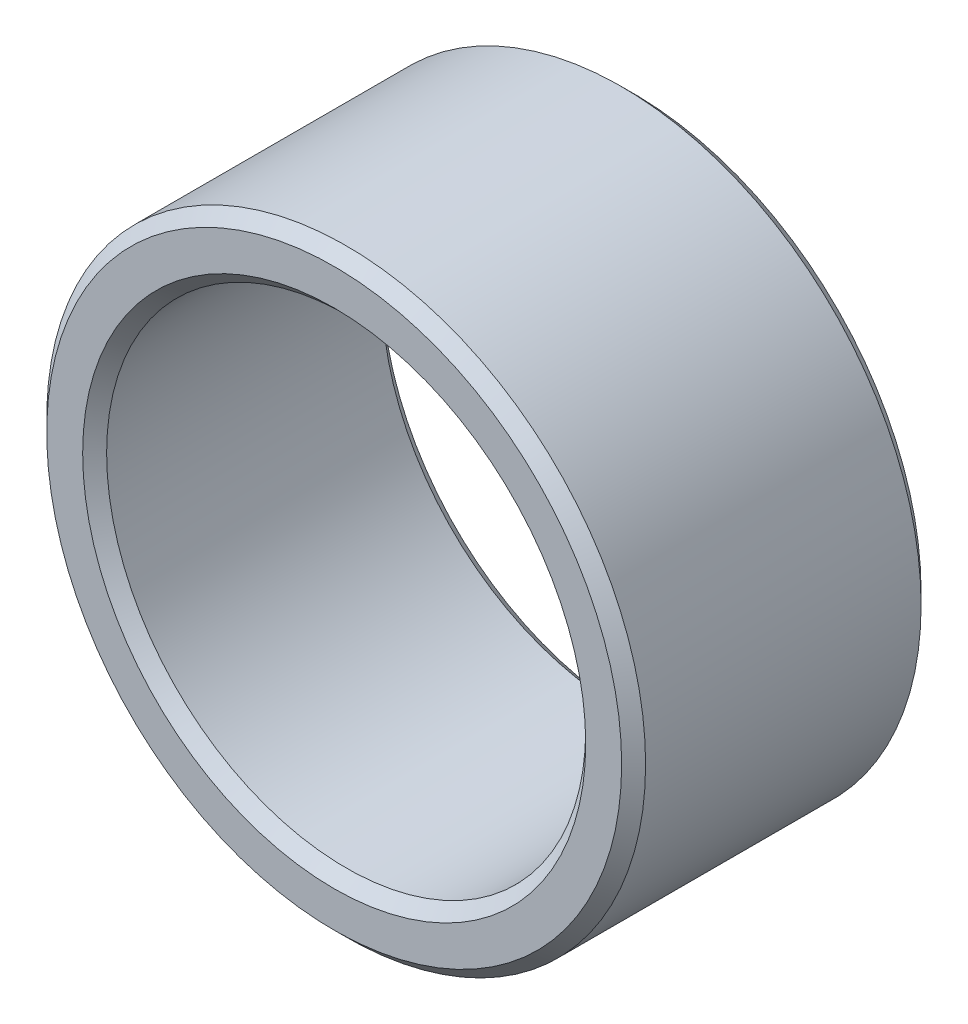
ISO-10303-21;
HEADER;
FILE_DESCRIPTION(('STEP AP214'),'2;1');
FILE_NAME('part.step','',(''),(''),'','','');
FILE_SCHEMA(('AUTOMOTIVE_DESIGN { 1 0 10303 214 1 1 1 1 }'));
ENDSEC;
DATA;
#1=APPLICATION_CONTEXT('core data for automotive mechanical design processes');
#2=APPLICATION_PROTOCOL_DEFINITION('international standard','automotive_design',2000,#1);
#3=PRODUCT_CONTEXT('',#1,'mechanical');
#4=PRODUCT('Part','Part','',(#3));
#5=PRODUCT_RELATED_PRODUCT_CATEGORY('part','',(#4));
#6=PRODUCT_DEFINITION_FORMATION('','',#4);
#7=PRODUCT_DEFINITION_CONTEXT('part definition',#1,'design');
#8=PRODUCT_DEFINITION('design','',#6,#7);
#9=PRODUCT_DEFINITION_SHAPE('','',#8);
#10=(LENGTH_UNIT() NAMED_UNIT(*) SI_UNIT(.MILLI.,.METRE.));
#11=(NAMED_UNIT(*) PLANE_ANGLE_UNIT() SI_UNIT($,.RADIAN.));
#12=(NAMED_UNIT(*) SI_UNIT($,.STERADIAN.) SOLID_ANGLE_UNIT());
#13=UNCERTAINTY_MEASURE_WITH_UNIT(LENGTH_MEASURE(1.E-05),#10,'distance_accuracy_value','');
#14=(GEOMETRIC_REPRESENTATION_CONTEXT(3) GLOBAL_UNCERTAINTY_ASSIGNED_CONTEXT((#13)) GLOBAL_UNIT_ASSIGNED_CONTEXT((#10,
#11,#12)) REPRESENTATION_CONTEXT('',''));
#15=CARTESIAN_POINT('',(0.,0.,0.));
#16=DIRECTION('',(0.,0.,1.));
#17=DIRECTION('',(1.,0.,0.));
#18=AXIS2_PLACEMENT_3D('',#15,#16,#17);
#19=CARTESIAN_POINT('',(0.,0.,5.));
#20=DIRECTION('',(0.,0.,1.));
#21=DIRECTION('',(1.,0.,0.));
#22=AXIS2_PLACEMENT_3D('',#19,#20,#21);
#23=PLANE('',#22);
#24=CARTESIAN_POINT('',(0.,0.,5.));
#25=DIRECTION('',(0.,0.,1.));
#26=DIRECTION('',(1.,0.,0.));
#27=AXIS2_PLACEMENT_3D('',#24,#25,#26);
#28=CIRCLE('',#27,4.2);
#29=CARTESIAN_POINT('',(4.2,0.,5.));
#30=VERTEX_POINT('',#29);
#31=EDGE_CURVE('E10',#30,#30,#28,.F.);
#32=ORIENTED_EDGE('',*,*,#31,.T.);
#33=EDGE_LOOP('',(#32));
#34=FACE_BOUND('',#33,.T.);
#35=CARTESIAN_POINT('',(0.,0.,5.));
#36=DIRECTION('',(0.,0.,1.));
#37=DIRECTION('',(1.,0.,0.));
#38=AXIS2_PLACEMENT_3D('',#35,#36,#37);
#39=CIRCLE('',#38,4.8);
#40=CARTESIAN_POINT('',(4.8,0.,5.));
#41=VERTEX_POINT('',#40);
#42=EDGE_CURVE('E21',#41,#41,#39,.T.);
#43=ORIENTED_EDGE('',*,*,#42,.T.);
#44=EDGE_LOOP('',(#43));
#45=FACE_BOUND('',#44,.T.);
#46=ADVANCED_FACE('F15',(#34,#45),#23,.T.);
#47=CARTESIAN_POINT('',(0.,0.,0.));
#48=DIRECTION('',(0.,0.,1.));
#49=DIRECTION('',(1.,0.,0.));
#50=AXIS2_PLACEMENT_3D('',#47,#48,#49);
#51=PLANE('',#50);
#52=CARTESIAN_POINT('',(0.,0.,0.));
#53=DIRECTION('',(0.,0.,1.));
#54=DIRECTION('',(1.,0.,0.));
#55=AXIS2_PLACEMENT_3D('',#52,#53,#54);
#56=CIRCLE('',#55,4.2);
#57=CARTESIAN_POINT('',(4.2,0.,0.));
#58=VERTEX_POINT('',#57);
#59=EDGE_CURVE('E25',#58,#58,#56,.T.);
#60=ORIENTED_EDGE('',*,*,#59,.T.);
#61=EDGE_LOOP('',(#60));
#62=FACE_BOUND('',#61,.T.);
#63=CARTESIAN_POINT('',(0.,0.,0.));
#64=DIRECTION('',(0.,0.,1.));
#65=DIRECTION('',(1.,0.,0.));
#66=AXIS2_PLACEMENT_3D('',#63,#64,#65);
#67=CIRCLE('',#66,4.8);
#68=CARTESIAN_POINT('',(4.8,0.,0.));
#69=VERTEX_POINT('',#68);
#70=EDGE_CURVE('E29',#69,#69,#67,.F.);
#71=ORIENTED_EDGE('',*,*,#70,.T.);
#72=EDGE_LOOP('',(#71));
#73=FACE_BOUND('',#72,.T.);
#74=ADVANCED_FACE('F66',(#62,#73),#51,.F.);
#75=CARTESIAN_POINT('',(0.,0.,5.));
#76=DIRECTION('',(0.,0.,-1.));
#77=DIRECTION('',(-1.,0.,0.));
#78=AXIS2_PLACEMENT_3D('',#75,#76,#77);
#79=CYLINDRICAL_SURFACE('',#78,5.);
#80=CARTESIAN_POINT('',(0.,0.,0.199999999999999));
#81=DIRECTION('',(0.,0.,1.));
#82=DIRECTION('',(1.,0.,0.));
#83=AXIS2_PLACEMENT_3D('',#80,#81,#82);
#84=CIRCLE('',#83,5.);
#85=CARTESIAN_POINT('',(5.,0.,0.199999999999999));
#86=VERTEX_POINT('',#85);
#87=EDGE_CURVE('E34',#86,#86,#84,.T.);
#88=ORIENTED_EDGE('',*,*,#87,.T.);
#89=EDGE_LOOP('',(#88));
#90=FACE_BOUND('',#89,.T.);
#91=CARTESIAN_POINT('',(0.,0.,4.8));
#92=DIRECTION('',(0.,0.,1.));
#93=DIRECTION('',(1.,0.,0.));
#94=AXIS2_PLACEMENT_3D('',#91,#92,#93);
#95=CIRCLE('',#94,5.);
#96=CARTESIAN_POINT('',(5.,0.,4.8));
#97=VERTEX_POINT('',#96);
#98=EDGE_CURVE('E37',#97,#97,#95,.F.);
#99=ORIENTED_EDGE('',*,*,#98,.T.);
#100=EDGE_LOOP('',(#99));
#101=FACE_BOUND('',#100,.T.);
#102=ADVANCED_FACE('F70',(#90,#101),#79,.T.);
#103=CARTESIAN_POINT('',(0.,0.,5.));
#104=DIRECTION('',(0.,0.,-1.));
#105=DIRECTION('',(-1.,0.,0.));
#106=AXIS2_PLACEMENT_3D('',#103,#104,#105);
#107=CYLINDRICAL_SURFACE('',#106,4.);
#108=CARTESIAN_POINT('',(0.,0.,0.200000000000001));
#109=DIRECTION('',(0.,0.,1.));
#110=DIRECTION('',(1.,0.,0.));
#111=AXIS2_PLACEMENT_3D('',#108,#109,#110);
#112=CIRCLE('',#111,4.);
#113=CARTESIAN_POINT('',(4.,0.,0.200000000000001));
#114=VERTEX_POINT('',#113);
#115=EDGE_CURVE('E40',#114,#114,#112,.F.);
#116=ORIENTED_EDGE('',*,*,#115,.T.);
#117=EDGE_LOOP('',(#116));
#118=FACE_BOUND('',#117,.T.);
#119=CARTESIAN_POINT('',(0.,0.,4.8));
#120=DIRECTION('',(0.,0.,1.));
#121=DIRECTION('',(1.,0.,0.));
#122=AXIS2_PLACEMENT_3D('',#119,#120,#121);
#123=CIRCLE('',#122,4.);
#124=CARTESIAN_POINT('',(4.,0.,4.8));
#125=VERTEX_POINT('',#124);
#126=EDGE_CURVE('E43',#125,#125,#123,.T.);
#127=ORIENTED_EDGE('',*,*,#126,.T.);
#128=EDGE_LOOP('',(#127));
#129=FACE_BOUND('',#128,.T.);
#130=ADVANCED_FACE('F47',(#118,#129),#107,.F.);
#131=CARTESIAN_POINT('',(0.,0.,0.));
#132=DIRECTION('',(0.,0.,-1.));
#133=DIRECTION('',(-1.,0.,0.));
#134=AXIS2_PLACEMENT_3D('',#131,#132,#133);
#135=CONICAL_SURFACE('',#134,4.2,0.785398163397444);
#136=ORIENTED_EDGE('',*,*,#115,.F.);
#137=EDGE_LOOP('',(#136));
#138=FACE_BOUND('',#137,.T.);
#139=ORIENTED_EDGE('',*,*,#59,.F.);
#140=EDGE_LOOP('',(#139));
#141=FACE_BOUND('',#140,.T.);
#142=ADVANCED_FACE('F62',(#138,#141),#135,.F.);
#143=CARTESIAN_POINT('',(0.,0.,0.199999999999999));
#144=DIRECTION('',(0.,0.,1.));
#145=DIRECTION('',(1.,0.,0.));
#146=AXIS2_PLACEMENT_3D('',#143,#144,#145);
#147=CONICAL_SURFACE('',#146,5.,0.78539816339745);
#148=ORIENTED_EDGE('',*,*,#70,.F.);
#149=EDGE_LOOP('',(#148));
#150=FACE_BOUND('',#149,.T.);
#151=ORIENTED_EDGE('',*,*,#87,.F.);
#152=EDGE_LOOP('',(#151));
#153=FACE_BOUND('',#152,.T.);
#154=ADVANCED_FACE('F52',(#150,#153),#147,.T.);
#155=CARTESIAN_POINT('',(0.,0.,4.8));
#156=DIRECTION('',(0.,0.,1.));
#157=DIRECTION('',(1.,0.,0.));
#158=AXIS2_PLACEMENT_3D('',#155,#156,#157);
#159=CONICAL_SURFACE('',#158,4.,0.785398163397446);
#160=ORIENTED_EDGE('',*,*,#31,.F.);
#161=EDGE_LOOP('',(#160));
#162=FACE_BOUND('',#161,.T.);
#163=ORIENTED_EDGE('',*,*,#126,.F.);
#164=EDGE_LOOP('',(#163));
#165=FACE_BOUND('',#164,.T.);
#166=ADVANCED_FACE('F49',(#162,#165),#159,.F.);
#167=CARTESIAN_POINT('',(0.,0.,5.));
#168=DIRECTION('',(0.,0.,-1.));
#169=DIRECTION('',(-1.,0.,0.));
#170=AXIS2_PLACEMENT_3D('',#167,#168,#169);
#171=CONICAL_SURFACE('',#170,4.8,0.785398163397446);
#172=ORIENTED_EDGE('',*,*,#98,.F.);
#173=EDGE_LOOP('',(#172));
#174=FACE_BOUND('',#173,.T.);
#175=ORIENTED_EDGE('',*,*,#42,.F.);
#176=EDGE_LOOP('',(#175));
#177=FACE_BOUND('',#176,.T.);
#178=ADVANCED_FACE('F51',(#174,#177),#171,.T.);
#179=CLOSED_SHELL('',(#46,#74,#102,#130,#142,#154,#166,#178));
#180=MANIFOLD_SOLID_BREP('B1',#179);
#181=ADVANCED_BREP_SHAPE_REPRESENTATION('',(#18,#180),#14);
#182=SHAPE_DEFINITION_REPRESENTATION(#9,#181);
ENDSEC;
END-ISO-10303-21;
